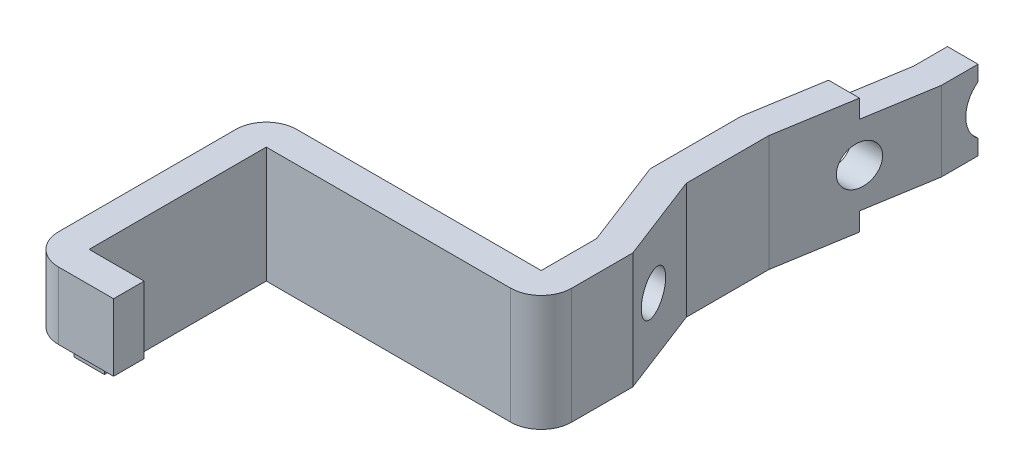
ISO-10303-21;
HEADER;
FILE_DESCRIPTION(('STEP AP214'),'2;1');
FILE_NAME('part.step','',(''),(''),'','','');
FILE_SCHEMA(('AUTOMOTIVE_DESIGN { 1 0 10303 214 1 1 1 1 }'));
ENDSEC;
DATA;
#1=APPLICATION_CONTEXT('core data for automotive mechanical design processes');
#2=APPLICATION_PROTOCOL_DEFINITION('international standard','automotive_design',2000,#1);
#3=PRODUCT_CONTEXT('',#1,'mechanical');
#4=PRODUCT('Part','Part','',(#3));
#5=PRODUCT_RELATED_PRODUCT_CATEGORY('part','',(#4));
#6=PRODUCT_DEFINITION_FORMATION('','',#4);
#7=PRODUCT_DEFINITION_CONTEXT('part definition',#1,'design');
#8=PRODUCT_DEFINITION('design','',#6,#7);
#9=PRODUCT_DEFINITION_SHAPE('','',#8);
#10=(LENGTH_UNIT() NAMED_UNIT(*) SI_UNIT(.MILLI.,.METRE.));
#11=(NAMED_UNIT(*) PLANE_ANGLE_UNIT() SI_UNIT($,.RADIAN.));
#12=(NAMED_UNIT(*) SI_UNIT($,.STERADIAN.) SOLID_ANGLE_UNIT());
#13=UNCERTAINTY_MEASURE_WITH_UNIT(LENGTH_MEASURE(1.E-05),#10,'distance_accuracy_value','');
#14=(GEOMETRIC_REPRESENTATION_CONTEXT(3) GLOBAL_UNCERTAINTY_ASSIGNED_CONTEXT((#13)) GLOBAL_UNIT_ASSIGNED_CONTEXT((#10,
#11,#12)) REPRESENTATION_CONTEXT('',''));
#15=CARTESIAN_POINT('',(0.,0.,0.));
#16=DIRECTION('',(0.,0.,1.));
#17=DIRECTION('',(1.,0.,0.));
#18=AXIS2_PLACEMENT_3D('',#15,#16,#17);
#19=CARTESIAN_POINT('',(0.,1.9,0.));
#20=DIRECTION('',(0.,-1.,0.));
#21=DIRECTION('',(1.,0.,0.));
#22=AXIS2_PLACEMENT_3D('',#19,#20,#21);
#23=PLANE('',#22);
#24=DIRECTION('',(0.,0.,-1.));
#25=VECTOR('',#24,1.);
#26=CARTESIAN_POINT('',(-6.,1.9,5.8));
#27=LINE('',#26,#25);
#28=CARTESIAN_POINT('',(-6.,1.9,5.8));
#29=VERTEX_POINT('',#28);
#30=CARTESIAN_POINT('',(-6.,1.9,0.));
#31=VERTEX_POINT('',#30);
#32=EDGE_CURVE('E518',#29,#31,#27,.T.);
#33=ORIENTED_EDGE('',*,*,#32,.F.);
#34=CARTESIAN_POINT('',(-5.,1.9,5.8));
#35=DIRECTION('',(0.,-1.,0.));
#36=DIRECTION('',(0.,0.,1.));
#37=AXIS2_PLACEMENT_3D('',#34,#35,#36);
#38=CIRCLE('',#37,1.);
#39=CARTESIAN_POINT('',(-5.,1.9,6.8));
#40=VERTEX_POINT('',#39);
#41=EDGE_CURVE('E36',#40,#29,#38,.T.);
#42=ORIENTED_EDGE('',*,*,#41,.F.);
#43=DIRECTION('',(1.,0.,0.));
#44=VECTOR('',#43,1.);
#45=CARTESIAN_POINT('',(-5.,1.9,6.8));
#46=LINE('',#45,#44);
#47=CARTESIAN_POINT('',(-3.2,1.9,6.8));
#48=VERTEX_POINT('',#47);
#49=EDGE_CURVE('E11',#40,#48,#46,.T.);
#50=ORIENTED_EDGE('',*,*,#49,.T.);
#51=DIRECTION('',(0.,0.,-1.));
#52=VECTOR('',#51,1.);
#53=CARTESIAN_POINT('',(-3.2,1.9,6.8));
#54=LINE('',#53,#52);
#55=CARTESIAN_POINT('',(-3.2,1.9,5.8));
#56=VERTEX_POINT('',#55);
#57=EDGE_CURVE('E27',#48,#56,#54,.T.);
#58=ORIENTED_EDGE('',*,*,#57,.T.);
#59=DIRECTION('',(1.,0.,0.));
#60=VECTOR('',#59,1.);
#61=CARTESIAN_POINT('',(-5.,1.9,5.8));
#62=LINE('',#61,#60);
#63=CARTESIAN_POINT('',(-5.,1.9,5.8));
#64=VERTEX_POINT('',#63);
#65=EDGE_CURVE('E586',#64,#56,#62,.T.);
#66=ORIENTED_EDGE('',*,*,#65,.F.);
#67=DIRECTION('',(0.,0.,-1.));
#68=VECTOR('',#67,1.);
#69=CARTESIAN_POINT('',(-5.,1.9,5.8));
#70=LINE('',#69,#68);
#71=CARTESIAN_POINT('',(-5.,1.9,0.));
#72=VERTEX_POINT('',#71);
#73=EDGE_CURVE('E503',#64,#72,#70,.T.);
#74=ORIENTED_EDGE('',*,*,#73,.T.);
#75=DIRECTION('',(-1.,0.,0.));
#76=VECTOR('',#75,1.);
#77=CARTESIAN_POINT('',(3.,1.9,0.));
#78=LINE('',#77,#76);
#79=CARTESIAN_POINT('',(3.,1.9,0.));
#80=VERTEX_POINT('',#79);
#81=EDGE_CURVE('E546',#80,#72,#78,.T.);
#82=ORIENTED_EDGE('',*,*,#81,.F.);
#83=CARTESIAN_POINT('',(3.,1.9,-1.));
#84=DIRECTION('',(0.,-1.,0.));
#85=DIRECTION('',(1.,0.,1.333377852575E-13));
#86=AXIS2_PLACEMENT_3D('',#83,#84,#85);
#87=CIRCLE('',#86,1.);
#88=CARTESIAN_POINT('',(4.,1.9,-1.));
#89=VERTEX_POINT('',#88);
#90=EDGE_CURVE('E547',#89,#80,#87,.T.);
#91=ORIENTED_EDGE('',*,*,#90,.F.);
#92=DIRECTION('',(0.,0.,1.));
#93=VECTOR('',#92,1.);
#94=CARTESIAN_POINT('',(4.,1.9,-3.));
#95=LINE('',#94,#93);
#96=CARTESIAN_POINT('',(4.,1.9,-3.));
#97=VERTEX_POINT('',#96);
#98=EDGE_CURVE('E602',#97,#89,#95,.T.);
#99=ORIENTED_EDGE('',*,*,#98,.F.);
#100=DIRECTION('',(0.360075594051496,0.,0.93292313004259));
#101=VECTOR('',#100,1.);
#102=CARTESIAN_POINT('',(2.9,1.9,-5.85));
#103=LINE('',#102,#101);
#104=CARTESIAN_POINT('',(2.9,1.9,-5.85));
#105=VERTEX_POINT('',#104);
#106=EDGE_CURVE('E245',#105,#97,#103,.T.);
#107=ORIENTED_EDGE('',*,*,#106,.F.);
#108=DIRECTION('',(0.,0.,1.));
#109=VECTOR('',#108,1.);
#110=CARTESIAN_POINT('',(2.9,1.9,-8.55));
#111=LINE('',#110,#109);
#112=CARTESIAN_POINT('',(2.9,1.9,-8.55));
#113=VERTEX_POINT('',#112);
#114=EDGE_CURVE('E478',#113,#105,#111,.T.);
#115=ORIENTED_EDGE('',*,*,#114,.F.);
#116=DIRECTION('',(-0.162749271583406,0.,0.986667458974436));
#117=VECTOR('',#116,1.);
#118=CARTESIAN_POINT('',(3.320618556701,1.9,-11.1));
#119=LINE('',#118,#117);
#120=CARTESIAN_POINT('',(3.320618556701,1.9,-11.1));
#121=VERTEX_POINT('',#120);
#122=EDGE_CURVE('E473',#121,#113,#119,.T.);
#123=ORIENTED_EDGE('',*,*,#122,.F.);
#124=DIRECTION('',(-1.,0.,0.));
#125=VECTOR('',#124,1.);
#126=CARTESIAN_POINT('',(3.320618556701,1.9,-11.1));
#127=LINE('',#126,#125);
#128=CARTESIAN_POINT('',(2.307105857053,1.9,-11.1));
#129=VERTEX_POINT('',#128);
#130=EDGE_CURVE('E471',#121,#129,#127,.T.);
#131=ORIENTED_EDGE('',*,*,#130,.T.);
#132=DIRECTION('',(0.162749271583406,0.,-0.986667458974436));
#133=VECTOR('',#132,1.);
#134=CARTESIAN_POINT('',(1.9,1.9,-8.631920741616));
#135=LINE('',#134,#133);
#136=CARTESIAN_POINT('',(1.9,1.9,-8.631920741616));
#137=VERTEX_POINT('',#136);
#138=EDGE_CURVE('E424',#137,#129,#135,.T.);
#139=ORIENTED_EDGE('',*,*,#138,.F.);
#140=DIRECTION('',(0.,0.,-1.));
#141=VECTOR('',#140,1.);
#142=CARTESIAN_POINT('',(1.9,1.9,-5.663714478111));
#143=LINE('',#142,#141);
#144=CARTESIAN_POINT('',(1.9,1.9,-5.663714478111));
#145=VERTEX_POINT('',#144);
#146=EDGE_CURVE('E437',#145,#137,#143,.T.);
#147=ORIENTED_EDGE('',*,*,#146,.F.);
#148=DIRECTION('',(-0.360075594051496,0.,-0.93292313004259));
#149=VECTOR('',#148,1.);
#150=CARTESIAN_POINT('',(3.,1.9,-2.813714478111));
#151=LINE('',#150,#149);
#152=CARTESIAN_POINT('',(3.,1.9,-2.813714478111));
#153=VERTEX_POINT('',#152);
#154=EDGE_CURVE('E444',#153,#145,#151,.T.);
#155=ORIENTED_EDGE('',*,*,#154,.F.);
#156=DIRECTION('',(0.,0.,-1.));
#157=VECTOR('',#156,1.);
#158=CARTESIAN_POINT('',(3.,1.9,-1.));
#159=LINE('',#158,#157);
#160=CARTESIAN_POINT('',(3.,1.9,-1.));
#161=VERTEX_POINT('',#160);
#162=EDGE_CURVE('E445',#161,#153,#159,.T.);
#163=ORIENTED_EDGE('',*,*,#162,.F.);
#164=DIRECTION('',(1.,0.,0.));
#165=VECTOR('',#164,1.);
#166=CARTESIAN_POINT('',(-5.,1.9,-1.));
#167=LINE('',#166,#165);
#168=CARTESIAN_POINT('',(-5.,1.9,-1.));
#169=VERTEX_POINT('',#168);
#170=EDGE_CURVE('E449',#169,#161,#167,.T.);
#171=ORIENTED_EDGE('',*,*,#170,.F.);
#172=CARTESIAN_POINT('',(-5.,1.9,0.));
#173=DIRECTION('',(0.,-1.,0.));
#174=DIRECTION('',(-1.,0.,0.));
#175=AXIS2_PLACEMENT_3D('',#172,#173,#174);
#176=CIRCLE('',#175,1.);
#177=EDGE_CURVE('E504',#31,#169,#176,.T.);
#178=ORIENTED_EDGE('',*,*,#177,.F.);
#179=EDGE_LOOP('',(#33,#42,#50,#58,#66,#74,#82,#91,#99,#107,#115,#123,#131,#139,#147,#155,#163,
#171,#178));
#180=FACE_BOUND('',#179,.T.);
#181=ADVANCED_FACE('F17',(#180),#23,.F.);
#182=CARTESIAN_POINT('',(-5.,16.50032,0.));
#183=DIRECTION('',(0.,-1.,0.));
#184=DIRECTION('',(-1.,0.,0.));
#185=AXIS2_PLACEMENT_3D('',#182,#183,#184);
#186=CYLINDRICAL_SURFACE('',#185,1.);
#187=DIRECTION('',(0.,-1.,0.));
#188=VECTOR('',#187,1.);
#189=CARTESIAN_POINT('',(-6.,1.9,0.));
#190=LINE('',#189,#188);
#191=CARTESIAN_POINT('',(-6.,-1.9,0.));
#192=VERTEX_POINT('',#191);
#193=EDGE_CURVE('E516',#31,#192,#190,.T.);
#194=ORIENTED_EDGE('',*,*,#193,.F.);
#195=ORIENTED_EDGE('',*,*,#177,.T.);
#196=DIRECTION('',(0.,1.,0.));
#197=VECTOR('',#196,1.);
#198=CARTESIAN_POINT('',(-5.,-1.9,-1.));
#199=LINE('',#198,#197);
#200=CARTESIAN_POINT('',(-5.,-1.9,-1.));
#201=VERTEX_POINT('',#200);
#202=EDGE_CURVE('E249',#201,#169,#199,.T.);
#203=ORIENTED_EDGE('',*,*,#202,.F.);
#204=CARTESIAN_POINT('',(-5.,-1.9,0.));
#205=DIRECTION('',(0.,1.,0.));
#206=DIRECTION('',(0.,0.,-1.));
#207=AXIS2_PLACEMENT_3D('',#204,#205,#206);
#208=CIRCLE('',#207,1.);
#209=EDGE_CURVE('E509',#201,#192,#208,.T.);
#210=ORIENTED_EDGE('',*,*,#209,.T.);
#211=EDGE_LOOP('',(#194,#195,#203,#210));
#212=FACE_BOUND('',#211,.T.);
#213=ADVANCED_FACE('F280',(#212),#186,.T.);
#214=CARTESIAN_POINT('',(0.,-1.9,0.));
#215=DIRECTION('',(0.,-1.,0.));
#216=DIRECTION('',(1.,0.,0.));
#217=AXIS2_PLACEMENT_3D('',#214,#215,#216);
#218=PLANE('',#217);
#219=DIRECTION('',(0.,0.,1.));
#220=VECTOR('',#219,1.);
#221=CARTESIAN_POINT('',(-6.,-1.9,0.));
#222=LINE('',#221,#220);
#223=CARTESIAN_POINT('',(-6.,-1.9,5.3));
#224=VERTEX_POINT('',#223);
#225=EDGE_CURVE('E519',#192,#224,#222,.T.);
#226=ORIENTED_EDGE('',*,*,#225,.F.);
#227=ORIENTED_EDGE('',*,*,#209,.F.);
#228=DIRECTION('',(-1.,0.,0.));
#229=VECTOR('',#228,1.);
#230=CARTESIAN_POINT('',(3.,-1.9,-1.));
#231=LINE('',#230,#229);
#232=CARTESIAN_POINT('',(3.,-1.9,-1.));
#233=VERTEX_POINT('',#232);
#234=EDGE_CURVE('E450',#233,#201,#231,.T.);
#235=ORIENTED_EDGE('',*,*,#234,.F.);
#236=DIRECTION('',(0.,0.,-1.));
#237=VECTOR('',#236,1.);
#238=CARTESIAN_POINT('',(3.,-1.9,-1.));
#239=LINE('',#238,#237);
#240=CARTESIAN_POINT('',(3.,-1.9,-2.813714478111));
#241=VERTEX_POINT('',#240);
#242=EDGE_CURVE('E524',#233,#241,#239,.T.);
#243=ORIENTED_EDGE('',*,*,#242,.T.);
#244=DIRECTION('',(0.360075594051496,0.,0.93292313004259));
#245=VECTOR('',#244,1.);
#246=CARTESIAN_POINT('',(1.9,-1.9,-5.663714478111));
#247=LINE('',#246,#245);
#248=CARTESIAN_POINT('',(1.9,-1.9,-5.663714478111));
#249=VERTEX_POINT('',#248);
#250=EDGE_CURVE('E440',#249,#241,#247,.T.);
#251=ORIENTED_EDGE('',*,*,#250,.F.);
#252=DIRECTION('',(0.,0.,-1.));
#253=VECTOR('',#252,1.);
#254=CARTESIAN_POINT('',(1.9,-1.9,-5.663714478111));
#255=LINE('',#254,#253);
#256=CARTESIAN_POINT('',(1.9,-1.9,-8.631920741616));
#257=VERTEX_POINT('',#256);
#258=EDGE_CURVE('E531',#249,#257,#255,.T.);
#259=ORIENTED_EDGE('',*,*,#258,.T.);
#260=DIRECTION('',(-0.162749271583406,0.,0.986667458974436));
#261=VECTOR('',#260,1.);
#262=CARTESIAN_POINT('',(2.307105857053,-1.9,-11.1));
#263=LINE('',#262,#261);
#264=CARTESIAN_POINT('',(2.307105857053,-1.9,-11.1));
#265=VERTEX_POINT('',#264);
#266=EDGE_CURVE('E432',#265,#257,#263,.T.);
#267=ORIENTED_EDGE('',*,*,#266,.F.);
#268=DIRECTION('',(-1.,0.,0.));
#269=VECTOR('',#268,1.);
#270=CARTESIAN_POINT('',(3.320618556701,-1.9,-11.1));
#271=LINE('',#270,#269);
#272=CARTESIAN_POINT('',(3.320618556701,-1.9,-11.1));
#273=VERTEX_POINT('',#272);
#274=EDGE_CURVE('E453',#273,#265,#271,.T.);
#275=ORIENTED_EDGE('',*,*,#274,.F.);
#276=DIRECTION('',(0.162749271583406,0.,-0.986667458974436));
#277=VECTOR('',#276,1.);
#278=CARTESIAN_POINT('',(2.9,-1.9,-8.55));
#279=LINE('',#278,#277);
#280=CARTESIAN_POINT('',(2.9,-1.9,-8.55));
#281=VERTEX_POINT('',#280);
#282=EDGE_CURVE('E488',#281,#273,#279,.T.);
#283=ORIENTED_EDGE('',*,*,#282,.F.);
#284=DIRECTION('',(0.,0.,1.));
#285=VECTOR('',#284,1.);
#286=CARTESIAN_POINT('',(2.9,-1.9,-8.55));
#287=LINE('',#286,#285);
#288=CARTESIAN_POINT('',(2.9,-1.9,-5.85));
#289=VERTEX_POINT('',#288);
#290=EDGE_CURVE('E487',#281,#289,#287,.T.);
#291=ORIENTED_EDGE('',*,*,#290,.T.);
#292=DIRECTION('',(-0.360075594051496,0.,-0.93292313004259));
#293=VECTOR('',#292,1.);
#294=CARTESIAN_POINT('',(4.,-1.9,-3.));
#295=LINE('',#294,#293);
#296=CARTESIAN_POINT('',(4.,-1.9,-3.));
#297=VERTEX_POINT('',#296);
#298=EDGE_CURVE('E539',#297,#289,#295,.T.);
#299=ORIENTED_EDGE('',*,*,#298,.F.);
#300=DIRECTION('',(0.,0.,1.));
#301=VECTOR('',#300,1.);
#302=CARTESIAN_POINT('',(4.,-1.9,-3.));
#303=LINE('',#302,#301);
#304=CARTESIAN_POINT('',(4.,-1.9,-0.9999999999999));
#305=VERTEX_POINT('',#304);
#306=EDGE_CURVE('E538',#297,#305,#303,.T.);
#307=ORIENTED_EDGE('',*,*,#306,.T.);
#308=CARTESIAN_POINT('',(3.,-1.9,-1.));
#309=DIRECTION('',(0.,1.,0.));
#310=DIRECTION('',(0.,0.,1.));
#311=AXIS2_PLACEMENT_3D('',#308,#309,#310);
#312=CIRCLE('',#311,1.);
#313=CARTESIAN_POINT('',(3.,-1.9,0.));
#314=VERTEX_POINT('',#313);
#315=EDGE_CURVE('E544',#314,#305,#312,.T.);
#316=ORIENTED_EDGE('',*,*,#315,.F.);
#317=DIRECTION('',(-1.,0.,0.));
#318=VECTOR('',#317,1.);
#319=CARTESIAN_POINT('',(3.,-1.9,0.));
#320=LINE('',#319,#318);
#321=CARTESIAN_POINT('',(-5.,-1.9,0.));
#322=VERTEX_POINT('',#321);
#323=EDGE_CURVE('E543',#314,#322,#320,.T.);
#324=ORIENTED_EDGE('',*,*,#323,.T.);
#325=DIRECTION('',(0.,0.,1.));
#326=VECTOR('',#325,1.);
#327=CARTESIAN_POINT('',(-5.,-1.9,0.));
#328=LINE('',#327,#326);
#329=CARTESIAN_POINT('',(-5.,-1.9,5.3));
#330=VERTEX_POINT('',#329);
#331=EDGE_CURVE('E550',#322,#330,#328,.T.);
#332=ORIENTED_EDGE('',*,*,#331,.T.);
#333=DIRECTION('',(1.,0.,0.));
#334=VECTOR('',#333,1.);
#335=CARTESIAN_POINT('',(-6.,-1.9,5.3));
#336=LINE('',#335,#334);
#337=EDGE_CURVE('E554',#224,#330,#336,.T.);
#338=ORIENTED_EDGE('',*,*,#337,.F.);
#339=EDGE_LOOP('',(#226,#227,#235,#243,#251,#259,#267,#275,#283,#291,#299,#307,#316,#324,#332,#338));
#340=FACE_BOUND('',#339,.T.);
#341=ADVANCED_FACE('F286',(#340),#218,.T.);
#342=CARTESIAN_POINT('',(-6.,-0.3,5.3));
#343=DIRECTION('',(0.,0.,-1.));
#344=DIRECTION('',(0.,-1.,0.));
#345=AXIS2_PLACEMENT_3D('',#342,#343,#344);
#346=PLANE('',#345);
#347=DIRECTION('',(0.,1.,0.));
#348=VECTOR('',#347,1.);
#349=CARTESIAN_POINT('',(-5.,-1.9,5.3));
#350=LINE('',#349,#348);
#351=CARTESIAN_POINT('',(-5.,-0.3,5.3));
#352=VERTEX_POINT('',#351);
#353=EDGE_CURVE('E553',#330,#352,#350,.T.);
#354=ORIENTED_EDGE('',*,*,#353,.T.);
#355=DIRECTION('',(1.,0.,0.));
#356=VECTOR('',#355,1.);
#357=CARTESIAN_POINT('',(-6.,-0.3,5.3));
#358=LINE('',#357,#356);
#359=CARTESIAN_POINT('',(-6.,-0.3,5.3));
#360=VERTEX_POINT('',#359);
#361=EDGE_CURVE('E559',#360,#352,#358,.T.);
#362=ORIENTED_EDGE('',*,*,#361,.F.);
#363=DIRECTION('',(0.,1.,0.));
#364=VECTOR('',#363,1.);
#365=CARTESIAN_POINT('',(-6.,-1.9,5.3));
#366=LINE('',#365,#364);
#367=EDGE_CURVE('E526',#224,#360,#366,.T.);
#368=ORIENTED_EDGE('',*,*,#367,.F.);
#369=ORIENTED_EDGE('',*,*,#337,.T.);
#370=EDGE_LOOP('',(#354,#362,#368,#369));
#371=FACE_BOUND('',#370,.T.);
#372=ADVANCED_FACE('F292',(#371),#346,.F.);
#373=CARTESIAN_POINT('',(-6.,0.,0.));
#374=DIRECTION('',(-1.,0.,0.));
#375=DIRECTION('',(0.,-1.,0.));
#376=AXIS2_PLACEMENT_3D('',#373,#374,#375);
#377=PLANE('',#376);
#378=DIRECTION('',(0.,1.,0.));
#379=VECTOR('',#378,1.);
#380=CARTESIAN_POINT('',(-6.,-0.3,5.8));
#381=LINE('',#380,#379);
#382=CARTESIAN_POINT('',(-6.,-0.3,5.8));
#383=VERTEX_POINT('',#382);
#384=EDGE_CURVE('E556',#383,#29,#381,.T.);
#385=ORIENTED_EDGE('',*,*,#384,.T.);
#386=ORIENTED_EDGE('',*,*,#32,.T.);
#387=ORIENTED_EDGE('',*,*,#193,.T.);
#388=ORIENTED_EDGE('',*,*,#225,.T.);
#389=ORIENTED_EDGE('',*,*,#367,.T.);
#390=DIRECTION('',(0.,0.,-1.));
#391=VECTOR('',#390,1.);
#392=CARTESIAN_POINT('',(-6.,-0.3,5.8));
#393=LINE('',#392,#391);
#394=EDGE_CURVE('E561',#383,#360,#393,.T.);
#395=ORIENTED_EDGE('',*,*,#394,.F.);
#396=EDGE_LOOP('',(#385,#386,#387,#388,#389,#395));
#397=FACE_BOUND('',#396,.T.);
#398=ADVANCED_FACE('F296',(#397),#377,.T.);
#399=CARTESIAN_POINT('',(-6.,-0.3,6.8));
#400=DIRECTION('',(0.,1.,0.));
#401=DIRECTION('',(0.,0.,-1.));
#402=AXIS2_PLACEMENT_3D('',#399,#400,#401);
#403=PLANE('',#402);
#404=DIRECTION('',(-1.,0.,0.));
#405=VECTOR('',#404,1.);
#406=CARTESIAN_POINT('',(-3.2,-0.3,5.8));
#407=LINE('',#406,#405);
#408=CARTESIAN_POINT('',(-3.2,-0.3,5.8));
#409=VERTEX_POINT('',#408);
#410=CARTESIAN_POINT('',(-5.,-0.3,5.8));
#411=VERTEX_POINT('',#410);
#412=EDGE_CURVE('E571',#409,#411,#407,.T.);
#413=ORIENTED_EDGE('',*,*,#412,.F.);
#414=DIRECTION('',(0.,0.,1.));
#415=VECTOR('',#414,1.);
#416=CARTESIAN_POINT('',(-3.2,-0.3,5.8));
#417=LINE('',#416,#415);
#418=CARTESIAN_POINT('',(-3.2,-0.3,6.8));
#419=VERTEX_POINT('',#418);
#420=EDGE_CURVE('E565',#409,#419,#417,.T.);
#421=ORIENTED_EDGE('',*,*,#420,.T.);
#422=DIRECTION('',(-1.,0.,0.));
#423=VECTOR('',#422,1.);
#424=CARTESIAN_POINT('',(-3.2,-0.3,6.8));
#425=LINE('',#424,#423);
#426=CARTESIAN_POINT('',(-5.,-0.3,6.8));
#427=VERTEX_POINT('',#426);
#428=EDGE_CURVE('E570',#419,#427,#425,.T.);
#429=ORIENTED_EDGE('',*,*,#428,.T.);
#430=CARTESIAN_POINT('',(-5.,-0.3,5.8));
#431=DIRECTION('',(0.,1.,0.));
#432=DIRECTION('',(-1.,0.,0.));
#433=AXIS2_PLACEMENT_3D('',#430,#431,#432);
#434=CIRCLE('',#433,1.);
#435=EDGE_CURVE('E579',#383,#427,#434,.T.);
#436=ORIENTED_EDGE('',*,*,#435,.F.);
#437=ORIENTED_EDGE('',*,*,#394,.T.);
#438=ORIENTED_EDGE('',*,*,#361,.T.);
#439=DIRECTION('',(0.,0.,-1.));
#440=VECTOR('',#439,1.);
#441=CARTESIAN_POINT('',(-5.,-0.3,5.8));
#442=LINE('',#441,#440);
#443=EDGE_CURVE('E582',#411,#352,#442,.T.);
#444=ORIENTED_EDGE('',*,*,#443,.F.);
#445=EDGE_LOOP('',(#413,#421,#429,#436,#437,#438,#444));
#446=FACE_BOUND('',#445,.T.);
#447=ADVANCED_FACE('F300',(#446),#403,.F.);
#448=CARTESIAN_POINT('',(-5.,0.,0.));
#449=DIRECTION('',(-1.,0.,0.));
#450=DIRECTION('',(0.,-1.,0.));
#451=AXIS2_PLACEMENT_3D('',#448,#449,#450);
#452=PLANE('',#451);
#453=ORIENTED_EDGE('',*,*,#353,.F.);
#454=ORIENTED_EDGE('',*,*,#331,.F.);
#455=DIRECTION('',(0.,1.,0.));
#456=VECTOR('',#455,1.);
#457=CARTESIAN_POINT('',(-5.,-1.9,0.));
#458=LINE('',#457,#456);
#459=EDGE_CURVE('E562',#322,#72,#458,.T.);
#460=ORIENTED_EDGE('',*,*,#459,.T.);
#461=ORIENTED_EDGE('',*,*,#73,.F.);
#462=DIRECTION('',(0.,-1.,0.));
#463=VECTOR('',#462,1.);
#464=CARTESIAN_POINT('',(-5.,1.9,5.8));
#465=LINE('',#464,#463);
#466=EDGE_CURVE('E585',#64,#411,#465,.T.);
#467=ORIENTED_EDGE('',*,*,#466,.T.);
#468=ORIENTED_EDGE('',*,*,#443,.T.);
#469=EDGE_LOOP('',(#453,#454,#460,#461,#467,#468));
#470=FACE_BOUND('',#469,.T.);
#471=ADVANCED_FACE('F304',(#470),#452,.F.);
#472=CARTESIAN_POINT('',(-6.,1.9,5.8));
#473=DIRECTION('',(0.,0.,-1.));
#474=DIRECTION('',(0.,-1.,0.));
#475=AXIS2_PLACEMENT_3D('',#472,#473,#474);
#476=PLANE('',#475);
#477=ORIENTED_EDGE('',*,*,#466,.F.);
#478=ORIENTED_EDGE('',*,*,#65,.T.);
#479=DIRECTION('',(0.,-1.,0.));
#480=VECTOR('',#479,1.);
#481=CARTESIAN_POINT('',(-3.2,1.9,5.8));
#482=LINE('',#481,#480);
#483=EDGE_CURVE('E573',#56,#409,#482,.T.);
#484=ORIENTED_EDGE('',*,*,#483,.T.);
#485=ORIENTED_EDGE('',*,*,#412,.T.);
#486=EDGE_LOOP('',(#477,#478,#484,#485));
#487=FACE_BOUND('',#486,.T.);
#488=ADVANCED_FACE('F308',(#487),#476,.T.);
#489=CARTESIAN_POINT('',(-3.2,0.,0.));
#490=DIRECTION('',(-1.,0.,0.));
#491=DIRECTION('',(0.,-1.,0.));
#492=AXIS2_PLACEMENT_3D('',#489,#490,#491);
#493=PLANE('',#492);
#494=ORIENTED_EDGE('',*,*,#483,.F.);
#495=ORIENTED_EDGE('',*,*,#57,.F.);
#496=DIRECTION('',(0.,1.,0.));
#497=VECTOR('',#496,1.);
#498=CARTESIAN_POINT('',(-3.2,-0.3,6.8));
#499=LINE('',#498,#497);
#500=EDGE_CURVE('E574',#419,#48,#499,.T.);
#501=ORIENTED_EDGE('',*,*,#500,.F.);
#502=ORIENTED_EDGE('',*,*,#420,.F.);
#503=EDGE_LOOP('',(#494,#495,#501,#502));
#504=FACE_BOUND('',#503,.T.);
#505=ADVANCED_FACE('F312',(#504),#493,.F.);
#506=CARTESIAN_POINT('',(-5.,-1.9,6.8));
#507=DIRECTION('',(0.,0.,1.));
#508=DIRECTION('',(0.,1.,0.));
#509=AXIS2_PLACEMENT_3D('',#506,#507,#508);
#510=PLANE('',#509);
#511=ORIENTED_EDGE('',*,*,#500,.T.);
#512=ORIENTED_EDGE('',*,*,#49,.F.);
#513=DIRECTION('',(0.,-1.,0.));
#514=VECTOR('',#513,1.);
#515=CARTESIAN_POINT('',(-5.,1.9,6.8));
#516=LINE('',#515,#514);
#517=EDGE_CURVE('E595',#40,#427,#516,.T.);
#518=ORIENTED_EDGE('',*,*,#517,.T.);
#519=ORIENTED_EDGE('',*,*,#428,.F.);
#520=EDGE_LOOP('',(#511,#512,#518,#519));
#521=FACE_BOUND('',#520,.T.);
#522=ADVANCED_FACE('F316',(#521),#510,.T.);
#523=CARTESIAN_POINT('',(-5.,-23.90032,5.8));
#524=DIRECTION('',(0.,1.,0.));
#525=DIRECTION('',(-1.,0.,0.));
#526=AXIS2_PLACEMENT_3D('',#523,#524,#525);
#527=CYLINDRICAL_SURFACE('',#526,1.);
#528=ORIENTED_EDGE('',*,*,#517,.F.);
#529=ORIENTED_EDGE('',*,*,#41,.T.);
#530=ORIENTED_EDGE('',*,*,#384,.F.);
#531=ORIENTED_EDGE('',*,*,#435,.T.);
#532=EDGE_LOOP('',(#528,#529,#530,#531));
#533=FACE_BOUND('',#532,.T.);
#534=ADVANCED_FACE('F320',(#533),#527,.T.);
#535=CARTESIAN_POINT('',(4.,1.9,0.));
#536=DIRECTION('',(0.,0.,-1.));
#537=DIRECTION('',(-1.,0.,0.));
#538=AXIS2_PLACEMENT_3D('',#535,#536,#537);
#539=PLANE('',#538);
#540=ORIENTED_EDGE('',*,*,#323,.F.);
#541=DIRECTION('',(0.,1.,0.));
#542=VECTOR('',#541,1.);
#543=CARTESIAN_POINT('',(3.,-1.9,0.));
#544=LINE('',#543,#542);
#545=EDGE_CURVE('E581',#314,#80,#544,.T.);
#546=ORIENTED_EDGE('',*,*,#545,.T.);
#547=ORIENTED_EDGE('',*,*,#81,.T.);
#548=ORIENTED_EDGE('',*,*,#459,.F.);
#549=EDGE_LOOP('',(#540,#546,#547,#548));
#550=FACE_BOUND('',#549,.T.);
#551=ADVANCED_FACE('F324',(#550),#539,.F.);
#552=CARTESIAN_POINT('',(3.,-9.680631101997,-1.));
#553=DIRECTION('',(0.,1.,0.));
#554=DIRECTION('',(0.,0.,1.));
#555=AXIS2_PLACEMENT_3D('',#552,#553,#554);
#556=CYLINDRICAL_SURFACE('',#555,1.);
#557=ORIENTED_EDGE('',*,*,#545,.F.);
#558=ORIENTED_EDGE('',*,*,#315,.T.);
#559=DIRECTION('',(0.,-1.,0.));
#560=VECTOR('',#559,1.);
#561=CARTESIAN_POINT('',(4.,1.9,-1.));
#562=LINE('',#561,#560);
#563=EDGE_CURVE('E600',#89,#305,#562,.T.);
#564=ORIENTED_EDGE('',*,*,#563,.F.);
#565=ORIENTED_EDGE('',*,*,#90,.T.);
#566=EDGE_LOOP('',(#557,#558,#564,#565));
#567=FACE_BOUND('',#566,.T.);
#568=ADVANCED_FACE('F327',(#567),#556,.T.);
#569=CARTESIAN_POINT('',(4.,1.9,-3.));
#570=DIRECTION('',(-1.,0.,0.));
#571=DIRECTION('',(0.,0.,1.));
#572=AXIS2_PLACEMENT_3D('',#569,#570,#571);
#573=PLANE('',#572);
#574=ORIENTED_EDGE('',*,*,#306,.F.);
#575=DIRECTION('',(0.,-1.,0.));
#576=VECTOR('',#575,1.);
#577=CARTESIAN_POINT('',(4.,1.9,-3.));
#578=LINE('',#577,#576);
#579=EDGE_CURVE('E343',#97,#297,#578,.T.);
#580=ORIENTED_EDGE('',*,*,#579,.F.);
#581=ORIENTED_EDGE('',*,*,#98,.T.);
#582=ORIENTED_EDGE('',*,*,#563,.T.);
#583=EDGE_LOOP('',(#574,#580,#581,#582));
#584=FACE_BOUND('',#583,.T.);
#585=ADVANCED_FACE('F331',(#584),#573,.F.);
#586=CARTESIAN_POINT('',(2.9,1.9,-5.85));
#587=DIRECTION('',(-0.93292313004259,0.,0.360075594051496));
#588=DIRECTION('',(0.360075594051496,0.,0.93292313004259));
#589=AXIS2_PLACEMENT_3D('',#586,#587,#588);
#590=PLANE('',#589);
#591=ORIENTED_EDGE('',*,*,#579,.T.);
#592=ORIENTED_EDGE('',*,*,#298,.T.);
#593=DIRECTION('',(0.,-1.,0.));
#594=VECTOR('',#593,1.);
#595=CARTESIAN_POINT('',(2.9,1.9,-5.85));
#596=LINE('',#595,#594);
#597=EDGE_CURVE('E246',#105,#289,#596,.T.);
#598=ORIENTED_EDGE('',*,*,#597,.F.);
#599=ORIENTED_EDGE('',*,*,#106,.T.);
#600=EDGE_LOOP('',(#591,#592,#598,#599));
#601=FACE_BOUND('',#600,.T.);
#602=CARTESIAN_POINT('',(3.57543859649117,0.,-4.1));
#603=DIRECTION('',(-0.93292313004259,0.,0.360075594051496));
#604=DIRECTION('',(-0.360075594051496,0.,-0.932923130042589));
#605=AXIS2_PLACEMENT_3D('',#602,#603,#604);
#606=ELLIPSE('',#605,0.696734788824805,0.65);
#607=CARTESIAN_POINT('',(3.32456140350874,0.,-4.75));
#608=VERTEX_POINT('',#607);
#609=EDGE_CURVE('E242',#608,#608,#606,.T.);
#610=ORIENTED_EDGE('',*,*,#609,.T.);
#611=EDGE_LOOP('',(#610));
#612=FACE_BOUND('',#611,.T.);
#613=ADVANCED_FACE('F276',(#601,#612),#590,.F.);
#614=CARTESIAN_POINT('',(2.9,1.9,-8.55));
#615=DIRECTION('',(-1.,0.,0.));
#616=DIRECTION('',(0.,0.,1.));
#617=AXIS2_PLACEMENT_3D('',#614,#615,#616);
#618=PLANE('',#617);
#619=ORIENTED_EDGE('',*,*,#597,.T.);
#620=ORIENTED_EDGE('',*,*,#290,.F.);
#621=DIRECTION('',(0.,-1.,0.));
#622=VECTOR('',#621,1.);
#623=CARTESIAN_POINT('',(2.9,1.9,-8.55));
#624=LINE('',#623,#622);
#625=EDGE_CURVE('E477',#113,#281,#624,.T.);
#626=ORIENTED_EDGE('',*,*,#625,.F.);
#627=ORIENTED_EDGE('',*,*,#114,.T.);
#628=EDGE_LOOP('',(#619,#620,#626,#627));
#629=FACE_BOUND('',#628,.T.);
#630=ADVANCED_FACE('F265',(#629),#618,.F.);
#631=CARTESIAN_POINT('',(3.7,1.9,-13.4));
#632=DIRECTION('',(-0.986667458974436,0.,-0.162749271583406));
#633=DIRECTION('',(-0.162749271583406,0.,0.986667458974436));
#634=AXIS2_PLACEMENT_3D('',#631,#632,#633);
#635=PLANE('',#634);
#636=ORIENTED_EDGE('',*,*,#122,.T.);
#637=ORIENTED_EDGE('',*,*,#625,.T.);
#638=ORIENTED_EDGE('',*,*,#282,.T.);
#639=DIRECTION('',(0.,1.,0.));
#640=VECTOR('',#639,1.);
#641=CARTESIAN_POINT('',(3.320618556701,-1.9,-11.1));
#642=LINE('',#641,#640);
#643=CARTESIAN_POINT('',(3.320618556701,-1.3,-11.1));
#644=VERTEX_POINT('',#643);
#645=EDGE_CURVE('E467',#273,#644,#642,.T.);
#646=ORIENTED_EDGE('',*,*,#645,.T.);
#647=DIRECTION('',(0.162749271583406,0.,-0.986667458974436));
#648=VECTOR('',#647,1.);
#649=CARTESIAN_POINT('',(3.320618556701,-1.3,-11.1));
#650=LINE('',#649,#648);
#651=CARTESIAN_POINT('',(3.7,-1.3,-13.4));
#652=VERTEX_POINT('',#651);
#653=EDGE_CURVE('E462',#644,#652,#650,.T.);
#654=ORIENTED_EDGE('',*,*,#653,.T.);
#655=DIRECTION('',(0.,-1.,0.));
#656=VECTOR('',#655,1.);
#657=CARTESIAN_POINT('',(3.7,1.3,-13.4));
#658=LINE('',#657,#656);
#659=CARTESIAN_POINT('',(3.7,1.3,-13.4));
#660=VERTEX_POINT('',#659);
#661=EDGE_CURVE('E414',#660,#652,#658,.T.);
#662=ORIENTED_EDGE('',*,*,#661,.F.);
#663=DIRECTION('',(-0.162749271583406,0.,0.986667458974436));
#664=VECTOR('',#663,1.);
#665=CARTESIAN_POINT('',(3.7,1.3,-13.4));
#666=LINE('',#665,#664);
#667=CARTESIAN_POINT('',(3.320618556701,1.3,-11.1));
#668=VERTEX_POINT('',#667);
#669=EDGE_CURVE('E464',#660,#668,#666,.T.);
#670=ORIENTED_EDGE('',*,*,#669,.T.);
#671=DIRECTION('',(0.,-1.,0.));
#672=VECTOR('',#671,1.);
#673=CARTESIAN_POINT('',(3.320618556701,1.9,-11.1));
#674=LINE('',#673,#672);
#675=EDGE_CURVE('E419',#121,#668,#674,.T.);
#676=ORIENTED_EDGE('',*,*,#675,.F.);
#677=EDGE_LOOP('',(#636,#637,#638,#646,#654,#662,#670,#676));
#678=FACE_BOUND('',#677,.T.);
#679=CARTESIAN_POINT('',(3.32061855670105,0.,-11.1));
#680=DIRECTION('',(-0.986667458974436,0.,-0.162749271583406));
#681=DIRECTION('',(-0.162749271583406,0.,0.986667458974436));
#682=AXIS2_PLACEMENT_3D('',#679,#680,#681);
#683=ELLIPSE('',#682,0.658783254771191,0.65);
#684=CARTESIAN_POINT('',(3.21340206185569,0.,-10.45));
#685=VERTEX_POINT('',#684);
#686=EDGE_CURVE('E21',#685,#685,#683,.F.);
#687=ORIENTED_EDGE('',*,*,#686,.F.);
#688=EDGE_LOOP('',(#687));
#689=FACE_BOUND('',#688,.T.);
#690=ADVANCED_FACE('F262',(#678,#689),#635,.F.);
#691=CARTESIAN_POINT('',(0.,1.9,-11.1));
#692=DIRECTION('',(0.,0.,1.));
#693=DIRECTION('',(0.,-1.,0.));
#694=AXIS2_PLACEMENT_3D('',#691,#692,#693);
#695=PLANE('',#694);
#696=ORIENTED_EDGE('',*,*,#675,.T.);
#697=DIRECTION('',(1.,0.,0.));
#698=VECTOR('',#697,1.);
#699=CARTESIAN_POINT('',(2.307105857053,1.3,-11.1));
#700=LINE('',#699,#698);
#701=CARTESIAN_POINT('',(2.307105857053,1.3,-11.1));
#702=VERTEX_POINT('',#701);
#703=EDGE_CURVE('E239',#702,#668,#700,.T.);
#704=ORIENTED_EDGE('',*,*,#703,.F.);
#705=DIRECTION('',(0.,-1.,0.));
#706=VECTOR('',#705,1.);
#707=CARTESIAN_POINT('',(2.307105857053,1.9,-11.1));
#708=LINE('',#707,#706);
#709=EDGE_CURVE('E421',#129,#702,#708,.T.);
#710=ORIENTED_EDGE('',*,*,#709,.F.);
#711=ORIENTED_EDGE('',*,*,#130,.F.);
#712=EDGE_LOOP('',(#696,#704,#710,#711));
#713=FACE_BOUND('',#712,.T.);
#714=ADVANCED_FACE('F264',(#713),#695,.F.);
#715=CARTESIAN_POINT('',(1.9,1.9,-8.631920741616));
#716=DIRECTION('',(0.986667458974436,0.,0.162749271583406));
#717=DIRECTION('',(0.162749271583406,0.,-0.986667458974436));
#718=AXIS2_PLACEMENT_3D('',#715,#716,#717);
#719=PLANE('',#718);
#720=DIRECTION('',(0.162749271583293,0.,-0.986667458974455));
#721=VECTOR('',#720,1.);
#722=CARTESIAN_POINT('',(2.307105857053,1.3,-11.1));
#723=LINE('',#722,#721);
#724=CARTESIAN_POINT('',(2.7,1.3,-13.48192074162));
#725=VERTEX_POINT('',#724);
#726=EDGE_CURVE('E426',#702,#725,#723,.T.);
#727=ORIENTED_EDGE('',*,*,#726,.T.);
#728=DIRECTION('',(0.,-1.,-2.54155670868E-13));
#729=VECTOR('',#728,1.);
#730=CARTESIAN_POINT('',(2.7,1.3,-13.48192074162));
#731=LINE('',#730,#729);
#732=CARTESIAN_POINT('',(2.7,-1.3,-13.48192074162));
#733=VERTEX_POINT('',#732);
#734=EDGE_CURVE('E235',#725,#733,#731,.T.);
#735=ORIENTED_EDGE('',*,*,#734,.T.);
#736=DIRECTION('',(-0.162749271583293,0.,0.986667458974455));
#737=VECTOR('',#736,1.);
#738=CARTESIAN_POINT('',(2.7,-1.3,-13.48192074162));
#739=LINE('',#738,#737);
#740=CARTESIAN_POINT('',(2.307105857053,-1.3,-11.1));
#741=VERTEX_POINT('',#740);
#742=EDGE_CURVE('E429',#733,#741,#739,.T.);
#743=ORIENTED_EDGE('',*,*,#742,.T.);
#744=DIRECTION('',(-1.850371707709E-13,1.,0.));
#745=VECTOR('',#744,1.);
#746=CARTESIAN_POINT('',(2.307105857053,-1.9,-11.1));
#747=LINE('',#746,#745);
#748=EDGE_CURVE('E250',#265,#741,#747,.T.);
#749=ORIENTED_EDGE('',*,*,#748,.F.);
#750=ORIENTED_EDGE('',*,*,#266,.T.);
#751=DIRECTION('',(0.,-1.,0.));
#752=VECTOR('',#751,1.);
#753=CARTESIAN_POINT('',(1.9,1.9,-8.631920741616));
#754=LINE('',#753,#752);
#755=EDGE_CURVE('E425',#137,#257,#754,.T.);
#756=ORIENTED_EDGE('',*,*,#755,.F.);
#757=ORIENTED_EDGE('',*,*,#138,.T.);
#758=ORIENTED_EDGE('',*,*,#709,.T.);
#759=EDGE_LOOP('',(#727,#735,#743,#749,#750,#756,#757,#758));
#760=FACE_BOUND('',#759,.T.);
#761=CARTESIAN_POINT('',(2.30710585705302,0.,-11.1));
#762=DIRECTION('',(0.986667458974436,0.,0.162749271583406));
#763=DIRECTION('',(-0.162749271583406,0.,0.986667458974436));
#764=AXIS2_PLACEMENT_3D('',#761,#762,#763);
#765=ELLIPSE('',#764,0.658783254771191,0.65);
#766=CARTESIAN_POINT('',(2.19988936220766,0.,-10.45));
#767=VERTEX_POINT('',#766);
#768=EDGE_CURVE('E251',#767,#767,#765,.F.);
#769=ORIENTED_EDGE('',*,*,#768,.F.);
#770=EDGE_LOOP('',(#769));
#771=FACE_BOUND('',#770,.T.);
#772=ADVANCED_FACE('F273',(#760,#771),#719,.F.);
#773=CARTESIAN_POINT('',(1.9,1.9,-5.663714478111));
#774=DIRECTION('',(1.,0.,0.));
#775=DIRECTION('',(0.,0.,-1.));
#776=AXIS2_PLACEMENT_3D('',#773,#774,#775);
#777=PLANE('',#776);
#778=ORIENTED_EDGE('',*,*,#755,.T.);
#779=ORIENTED_EDGE('',*,*,#258,.F.);
#780=DIRECTION('',(0.,-1.,0.));
#781=VECTOR('',#780,1.);
#782=CARTESIAN_POINT('',(1.9,1.9,-5.663714478111));
#783=LINE('',#782,#781);
#784=EDGE_CURVE('E438',#145,#249,#783,.T.);
#785=ORIENTED_EDGE('',*,*,#784,.F.);
#786=ORIENTED_EDGE('',*,*,#146,.T.);
#787=EDGE_LOOP('',(#778,#779,#785,#786));
#788=FACE_BOUND('',#787,.T.);
#789=ADVANCED_FACE('F357',(#788),#777,.F.);
#790=CARTESIAN_POINT('',(3.,1.9,-2.813714478111));
#791=DIRECTION('',(0.93292313004259,0.,-0.360075594051496));
#792=DIRECTION('',(-0.360075594051496,0.,-0.93292313004259));
#793=AXIS2_PLACEMENT_3D('',#790,#791,#792);
#794=PLANE('',#793);
#795=ORIENTED_EDGE('',*,*,#784,.T.);
#796=ORIENTED_EDGE('',*,*,#250,.T.);
#797=DIRECTION('',(0.,-1.,0.));
#798=VECTOR('',#797,1.);
#799=CARTESIAN_POINT('',(3.,1.9,-2.813714478111));
#800=LINE('',#799,#798);
#801=EDGE_CURVE('E441',#153,#241,#800,.T.);
#802=ORIENTED_EDGE('',*,*,#801,.F.);
#803=ORIENTED_EDGE('',*,*,#154,.T.);
#804=EDGE_LOOP('',(#795,#796,#802,#803));
#805=FACE_BOUND('',#804,.T.);
#806=CARTESIAN_POINT('',(2.50353892137622,0.,-4.1));
#807=DIRECTION('',(0.93292313004259,0.,-0.360075594051496));
#808=DIRECTION('',(-0.360075594051496,0.,-0.932923130042589));
#809=AXIS2_PLACEMENT_3D('',#806,#807,#808);
#810=ELLIPSE('',#809,0.696734788824805,0.65);
#811=CARTESIAN_POINT('',(2.25266172839378,0.,-4.75));
#812=VERTEX_POINT('',#811);
#813=EDGE_CURVE('E247',#812,#812,#810,.F.);
#814=ORIENTED_EDGE('',*,*,#813,.F.);
#815=EDGE_LOOP('',(#814));
#816=FACE_BOUND('',#815,.T.);
#817=ADVANCED_FACE('F354',(#805,#816),#794,.F.);
#818=CARTESIAN_POINT('',(3.,1.9,-1.));
#819=DIRECTION('',(1.,0.,0.));
#820=DIRECTION('',(0.,0.,-1.));
#821=AXIS2_PLACEMENT_3D('',#818,#819,#820);
#822=PLANE('',#821);
#823=ORIENTED_EDGE('',*,*,#801,.T.);
#824=ORIENTED_EDGE('',*,*,#242,.F.);
#825=DIRECTION('',(0.,-1.,0.));
#826=VECTOR('',#825,1.);
#827=CARTESIAN_POINT('',(3.,1.9,-1.));
#828=LINE('',#827,#826);
#829=EDGE_CURVE('E446',#161,#233,#828,.T.);
#830=ORIENTED_EDGE('',*,*,#829,.F.);
#831=ORIENTED_EDGE('',*,*,#162,.T.);
#832=EDGE_LOOP('',(#823,#824,#830,#831));
#833=FACE_BOUND('',#832,.T.);
#834=ADVANCED_FACE('F356',(#833),#822,.F.);
#835=CARTESIAN_POINT('',(-4.,1.9,-1.));
#836=DIRECTION('',(0.,0.,1.));
#837=DIRECTION('',(1.,0.,0.));
#838=AXIS2_PLACEMENT_3D('',#835,#836,#837);
#839=PLANE('',#838);
#840=ORIENTED_EDGE('',*,*,#170,.T.);
#841=ORIENTED_EDGE('',*,*,#829,.T.);
#842=ORIENTED_EDGE('',*,*,#234,.T.);
#843=ORIENTED_EDGE('',*,*,#202,.T.);
#844=EDGE_LOOP('',(#840,#841,#842,#843));
#845=FACE_BOUND('',#844,.T.);
#846=ADVANCED_FACE('F350',(#845),#839,.F.);
#847=CARTESIAN_POINT('',(0.,0.,-4.1));
#848=DIRECTION('',(-1.,0.,0.));
#849=DIRECTION('',(0.,0.,1.));
#850=AXIS2_PLACEMENT_3D('',#847,#848,#849);
#851=CYLINDRICAL_SURFACE('',#850,0.65);
#852=ORIENTED_EDGE('',*,*,#609,.F.);
#853=EDGE_LOOP('',(#852));
#854=FACE_BOUND('',#853,.T.);
#855=ORIENTED_EDGE('',*,*,#813,.T.);
#856=EDGE_LOOP('',(#855));
#857=FACE_BOUND('',#856,.T.);
#858=ADVANCED_FACE('F346',(#854,#857),#851,.F.);
#859=CARTESIAN_POINT('',(0.,-1.3,-11.1));
#860=DIRECTION('',(0.,0.,1.));
#861=DIRECTION('',(0.,-1.,0.));
#862=AXIS2_PLACEMENT_3D('',#859,#860,#861);
#863=PLANE('',#862);
#864=ORIENTED_EDGE('',*,*,#748,.T.);
#865=DIRECTION('',(1.,0.,0.));
#866=VECTOR('',#865,1.);
#867=CARTESIAN_POINT('',(2.307105857053,-1.3,-11.1));
#868=LINE('',#867,#866);
#869=EDGE_CURVE('E434',#741,#644,#868,.T.);
#870=ORIENTED_EDGE('',*,*,#869,.T.);
#871=ORIENTED_EDGE('',*,*,#645,.F.);
#872=ORIENTED_EDGE('',*,*,#274,.T.);
#873=EDGE_LOOP('',(#864,#870,#871,#872));
#874=FACE_BOUND('',#873,.T.);
#875=ADVANCED_FACE('F349',(#874),#863,.F.);
#876=CARTESIAN_POINT('',(0.,-1.3,-14.6));
#877=DIRECTION('',(0.,1.,0.));
#878=DIRECTION('',(0.,0.,1.));
#879=AXIS2_PLACEMENT_3D('',#876,#877,#878);
#880=PLANE('',#879);
#881=ORIENTED_EDGE('',*,*,#742,.F.);
#882=DIRECTION('',(-1.612588891599E-13,0.,-1.));
#883=VECTOR('',#882,1.);
#884=CARTESIAN_POINT('',(2.7,-1.3,-13.48192074162));
#885=LINE('',#884,#883);
#886=CARTESIAN_POINT('',(2.7,-1.3,-14.6));
#887=VERTEX_POINT('',#886);
#888=EDGE_CURVE('E454',#733,#887,#885,.T.);
#889=ORIENTED_EDGE('',*,*,#888,.T.);
#890=DIRECTION('',(1.,0.,0.));
#891=VECTOR('',#890,1.);
#892=CARTESIAN_POINT('',(2.7,-1.3,-14.6));
#893=LINE('',#892,#891);
#894=CARTESIAN_POINT('',(3.7,-1.3,-14.6));
#895=VERTEX_POINT('',#894);
#896=EDGE_CURVE('E403',#887,#895,#893,.T.);
#897=ORIENTED_EDGE('',*,*,#896,.T.);
#898=DIRECTION('',(0.,0.,1.));
#899=VECTOR('',#898,1.);
#900=CARTESIAN_POINT('',(3.7,-1.3,-14.6));
#901=LINE('',#900,#899);
#902=EDGE_CURVE('E457',#895,#652,#901,.T.);
#903=ORIENTED_EDGE('',*,*,#902,.T.);
#904=ORIENTED_EDGE('',*,*,#653,.F.);
#905=ORIENTED_EDGE('',*,*,#869,.F.);
#906=EDGE_LOOP('',(#881,#889,#897,#903,#904,#905));
#907=FACE_BOUND('',#906,.T.);
#908=ADVANCED_FACE('F376',(#907),#880,.F.);
#909=CARTESIAN_POINT('',(3.7,1.9,-14.6));
#910=DIRECTION('',(-1.,0.,0.));
#911=DIRECTION('',(0.,0.,1.));
#912=AXIS2_PLACEMENT_3D('',#909,#910,#911);
#913=PLANE('',#912);
#914=DIRECTION('',(0.,-1.,0.));
#915=VECTOR('',#914,1.);
#916=CARTESIAN_POINT('',(3.7,1.3,-14.6));
#917=LINE('',#916,#915);
#918=CARTESIAN_POINT('',(3.7,1.3,-14.6));
#919=VERTEX_POINT('',#918);
#920=CARTESIAN_POINT('',(3.7,0.7999999999996,-14.6));
#921=VERTEX_POINT('',#920);
#922=EDGE_CURVE('E229',#919,#921,#917,.T.);
#923=ORIENTED_EDGE('',*,*,#922,.F.);
#924=DIRECTION('',(0.,0.,1.));
#925=VECTOR('',#924,1.);
#926=CARTESIAN_POINT('',(3.7,1.3,-14.6));
#927=LINE('',#926,#925);
#928=EDGE_CURVE('E227',#919,#660,#927,.T.);
#929=ORIENTED_EDGE('',*,*,#928,.T.);
#930=ORIENTED_EDGE('',*,*,#661,.T.);
#931=ORIENTED_EDGE('',*,*,#902,.F.);
#932=DIRECTION('',(0.,-1.,0.));
#933=VECTOR('',#932,1.);
#934=CARTESIAN_POINT('',(3.7,-0.7999999999997,-14.6));
#935=LINE('',#934,#933);
#936=CARTESIAN_POINT('',(3.7,-0.7999999999997,-14.6));
#937=VERTEX_POINT('',#936);
#938=EDGE_CURVE('E218',#937,#895,#935,.T.);
#939=ORIENTED_EDGE('',*,*,#938,.F.);
#940=CARTESIAN_POINT('',(3.7,0.,-15.2));
#941=DIRECTION('',(1.,0.,0.));
#942=DIRECTION('',(0.,0.799999999999868,0.600000000000176));
#943=AXIS2_PLACEMENT_3D('',#940,#941,#942);
#944=CIRCLE('',#943,0.9999999999997);
#945=EDGE_CURVE('E228',#921,#937,#944,.T.);
#946=ORIENTED_EDGE('',*,*,#945,.F.);
#947=EDGE_LOOP('',(#923,#929,#930,#931,#939,#946));
#948=FACE_BOUND('',#947,.T.);
#949=ADVANCED_FACE('F380',(#948),#913,.F.);
#950=CARTESIAN_POINT('',(2.7,0.,-15.2));
#951=DIRECTION('',(-1.,0.,0.));
#952=DIRECTION('',(0.,-1.,0.));
#953=AXIS2_PLACEMENT_3D('',#950,#951,#952);
#954=CYLINDRICAL_SURFACE('',#953,0.9999999999997);
#955=DIRECTION('',(1.,0.,0.));
#956=VECTOR('',#955,1.);
#957=CARTESIAN_POINT('',(2.7,-0.7999999999997,-14.6));
#958=LINE('',#957,#956);
#959=CARTESIAN_POINT('',(2.7,-0.7999999999997,-14.6));
#960=VERTEX_POINT('',#959);
#961=EDGE_CURVE('E253',#960,#937,#958,.T.);
#962=ORIENTED_EDGE('',*,*,#961,.F.);
#963=CARTESIAN_POINT('',(2.7,0.,-15.2));
#964=DIRECTION('',(-1.,0.,0.));
#965=DIRECTION('',(0.,-0.799999999999868,0.600000000000176));
#966=AXIS2_PLACEMENT_3D('',#963,#964,#965);
#967=CIRCLE('',#966,0.9999999999997);
#968=CARTESIAN_POINT('',(2.7,0.7999999999996,-14.6));
#969=VERTEX_POINT('',#968);
#970=EDGE_CURVE('E411',#960,#969,#967,.T.);
#971=ORIENTED_EDGE('',*,*,#970,.T.);
#972=DIRECTION('',(-1.,0.,0.));
#973=VECTOR('',#972,1.);
#974=CARTESIAN_POINT('',(3.7,0.7999999999996,-14.6));
#975=LINE('',#974,#973);
#976=EDGE_CURVE('E206',#921,#969,#975,.T.);
#977=ORIENTED_EDGE('',*,*,#976,.F.);
#978=ORIENTED_EDGE('',*,*,#945,.T.);
#979=EDGE_LOOP('',(#962,#971,#977,#978));
#980=FACE_BOUND('',#979,.T.);
#981=ADVANCED_FACE('F384',(#980),#954,.F.);
#982=CARTESIAN_POINT('',(2.7,1.9,-14.6));
#983=DIRECTION('',(0.,0.,1.));
#984=DIRECTION('',(1.,0.,0.));
#985=AXIS2_PLACEMENT_3D('',#982,#983,#984);
#986=PLANE('',#985);
#987=DIRECTION('',(0.,-1.,0.));
#988=VECTOR('',#987,1.);
#989=CARTESIAN_POINT('',(2.7,1.3,-14.6));
#990=LINE('',#989,#988);
#991=CARTESIAN_POINT('',(2.7,1.3,-14.6));
#992=VERTEX_POINT('',#991);
#993=EDGE_CURVE('E210',#992,#969,#990,.T.);
#994=ORIENTED_EDGE('',*,*,#993,.F.);
#995=DIRECTION('',(1.,0.,0.));
#996=VECTOR('',#995,1.);
#997=CARTESIAN_POINT('',(2.7,1.3,-14.6));
#998=LINE('',#997,#996);
#999=EDGE_CURVE('E213',#992,#919,#998,.T.);
#1000=ORIENTED_EDGE('',*,*,#999,.T.);
#1001=ORIENTED_EDGE('',*,*,#922,.T.);
#1002=ORIENTED_EDGE('',*,*,#976,.T.);
#1003=EDGE_LOOP('',(#994,#1000,#1001,#1002));
#1004=FACE_BOUND('',#1003,.T.);
#1005=ADVANCED_FACE('F212',(#1004),#986,.F.);
#1006=CARTESIAN_POINT('',(0.,1.3,-11.1));
#1007=DIRECTION('',(0.,-1.,0.));
#1008=DIRECTION('',(0.,0.,-1.));
#1009=AXIS2_PLACEMENT_3D('',#1006,#1007,#1008);
#1010=PLANE('',#1009);
#1011=ORIENTED_EDGE('',*,*,#669,.F.);
#1012=ORIENTED_EDGE('',*,*,#928,.F.);
#1013=ORIENTED_EDGE('',*,*,#999,.F.);
#1014=DIRECTION('',(-1.707914343318E-13,0.,-1.));
#1015=VECTOR('',#1014,1.);
#1016=CARTESIAN_POINT('',(2.7,1.3,-13.48192074162));
#1017=LINE('',#1016,#1015);
#1018=EDGE_CURVE('E217',#725,#992,#1017,.T.);
#1019=ORIENTED_EDGE('',*,*,#1018,.F.);
#1020=ORIENTED_EDGE('',*,*,#726,.F.);
#1021=ORIENTED_EDGE('',*,*,#703,.T.);
#1022=EDGE_LOOP('',(#1011,#1012,#1013,#1019,#1020,#1021));
#1023=FACE_BOUND('',#1022,.T.);
#1024=ADVANCED_FACE('F224',(#1023),#1010,.F.);
#1025=CARTESIAN_POINT('',(2.7,1.9,-13.48192074162));
#1026=DIRECTION('',(1.,0.,0.));
#1027=DIRECTION('',(0.,0.,-1.));
#1028=AXIS2_PLACEMENT_3D('',#1025,#1026,#1027);
#1029=PLANE('',#1028);
#1030=DIRECTION('',(0.,-1.,0.));
#1031=VECTOR('',#1030,1.);
#1032=CARTESIAN_POINT('',(2.7,-0.7999999999997,-14.6));
#1033=LINE('',#1032,#1031);
#1034=EDGE_CURVE('E237',#960,#887,#1033,.T.);
#1035=ORIENTED_EDGE('',*,*,#1034,.T.);
#1036=ORIENTED_EDGE('',*,*,#888,.F.);
#1037=ORIENTED_EDGE('',*,*,#734,.F.);
#1038=ORIENTED_EDGE('',*,*,#1018,.T.);
#1039=ORIENTED_EDGE('',*,*,#993,.T.);
#1040=ORIENTED_EDGE('',*,*,#970,.F.);
#1041=EDGE_LOOP('',(#1035,#1036,#1037,#1038,#1039,#1040));
#1042=FACE_BOUND('',#1041,.T.);
#1043=ADVANCED_FACE('F232',(#1042),#1029,.F.);
#1044=CARTESIAN_POINT('',(2.7,1.9,-14.6));
#1045=DIRECTION('',(0.,0.,1.));
#1046=DIRECTION('',(1.,0.,0.));
#1047=AXIS2_PLACEMENT_3D('',#1044,#1045,#1046);
#1048=PLANE('',#1047);
#1049=ORIENTED_EDGE('',*,*,#938,.T.);
#1050=ORIENTED_EDGE('',*,*,#896,.F.);
#1051=ORIENTED_EDGE('',*,*,#1034,.F.);
#1052=ORIENTED_EDGE('',*,*,#961,.T.);
#1053=EDGE_LOOP('',(#1049,#1050,#1051,#1052));
#1054=FACE_BOUND('',#1053,.T.);
#1055=ADVANCED_FACE('F394',(#1054),#1048,.F.);
#1056=CARTESIAN_POINT('',(0.,0.,-11.1));
#1057=DIRECTION('',(-1.,0.,0.));
#1058=DIRECTION('',(0.,0.,1.));
#1059=AXIS2_PLACEMENT_3D('',#1056,#1057,#1058);
#1060=CYLINDRICAL_SURFACE('',#1059,0.65);
#1061=ORIENTED_EDGE('',*,*,#686,.T.);
#1062=EDGE_LOOP('',(#1061));
#1063=FACE_BOUND('',#1062,.T.);
#1064=ORIENTED_EDGE('',*,*,#768,.T.);
#1065=EDGE_LOOP('',(#1064));
#1066=FACE_BOUND('',#1065,.T.);
#1067=ADVANCED_FACE('F19',(#1063,#1066),#1060,.F.);
#1068=CLOSED_SHELL('',(#181,#213,#341,#372,#398,#447,#471,#488,#505,#522,#534,#551,#568,#585,
#613,#630,#690,#714,#772,#789,#817,#834,#846,#858,#875,#908,#949,#981,#1005,#1024,#1043,#1055,#1067));
#1069=MANIFOLD_SOLID_BREP('B1',#1068);
#1070=ADVANCED_BREP_SHAPE_REPRESENTATION('',(#18,#1069),#14);
#1071=SHAPE_DEFINITION_REPRESENTATION(#9,#1070);
ENDSEC;
END-ISO-10303-21;
